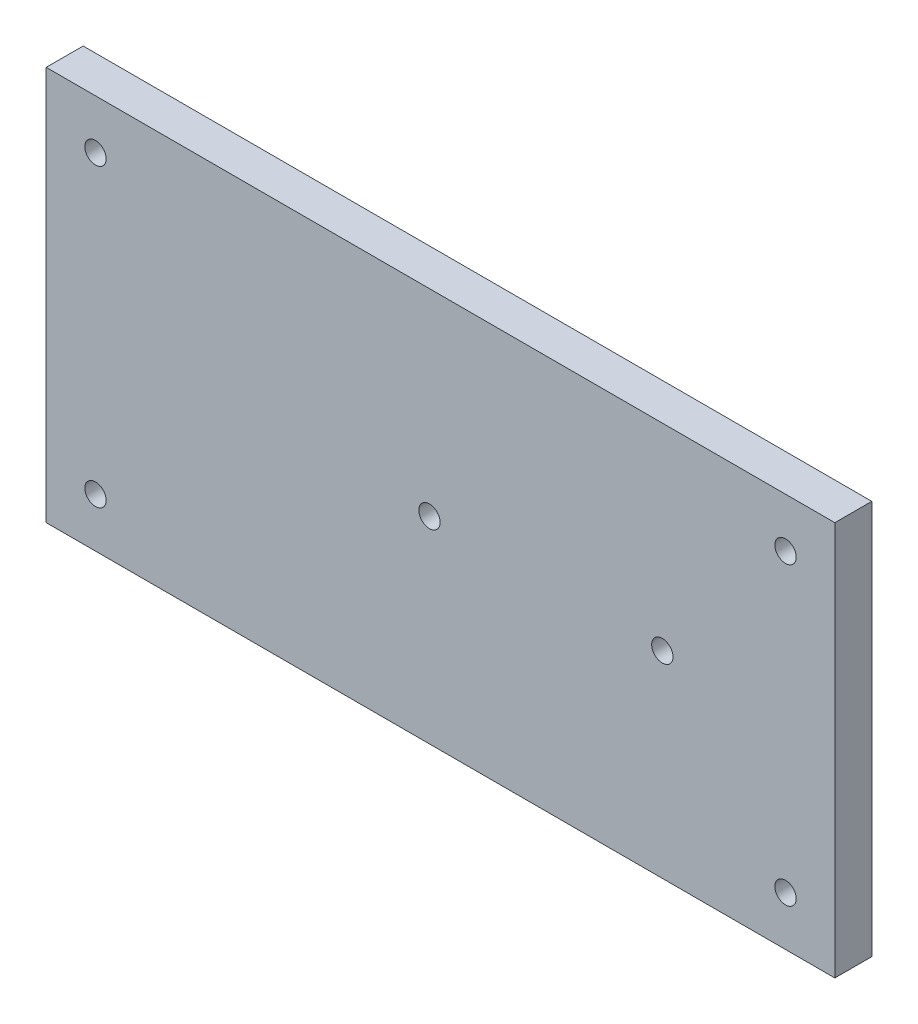
ISO-10303-21;
HEADER;
FILE_DESCRIPTION(('STEP AP214'),'2;1');
FILE_NAME('part.step','',(''),(''),'','','');
FILE_SCHEMA(('AUTOMOTIVE_DESIGN { 1 0 10303 214 1 1 1 1 }'));
ENDSEC;
DATA;
#1=APPLICATION_CONTEXT('core data for automotive mechanical design processes');
#2=APPLICATION_PROTOCOL_DEFINITION('international standard','automotive_design',2000,#1);
#3=PRODUCT_CONTEXT('',#1,'mechanical');
#4=PRODUCT('Part','Part','',(#3));
#5=PRODUCT_RELATED_PRODUCT_CATEGORY('part','',(#4));
#6=PRODUCT_DEFINITION_FORMATION('','',#4);
#7=PRODUCT_DEFINITION_CONTEXT('part definition',#1,'design');
#8=PRODUCT_DEFINITION('design','',#6,#7);
#9=PRODUCT_DEFINITION_SHAPE('','',#8);
#10=(LENGTH_UNIT() NAMED_UNIT(*) SI_UNIT(.MILLI.,.METRE.));
#11=(NAMED_UNIT(*) PLANE_ANGLE_UNIT() SI_UNIT($,.RADIAN.));
#12=(NAMED_UNIT(*) SI_UNIT($,.STERADIAN.) SOLID_ANGLE_UNIT());
#13=UNCERTAINTY_MEASURE_WITH_UNIT(LENGTH_MEASURE(1.E-05),#10,'distance_accuracy_value','');
#14=(GEOMETRIC_REPRESENTATION_CONTEXT(3) GLOBAL_UNCERTAINTY_ASSIGNED_CONTEXT((#13)) GLOBAL_UNIT_ASSIGNED_CONTEXT((#10,
#11,#12)) REPRESENTATION_CONTEXT('',''));
#15=CARTESIAN_POINT('',(0.,0.,0.));
#16=DIRECTION('',(0.,0.,1.));
#17=DIRECTION('',(1.,0.,0.));
#18=AXIS2_PLACEMENT_3D('',#15,#16,#17);
#19=CARTESIAN_POINT('',(0.,0.,9.525));
#20=DIRECTION('',(1.,0.,0.));
#21=DIRECTION('',(0.,0.,-1.));
#22=AXIS2_PLACEMENT_3D('',#19,#20,#21);
#23=PLANE('',#22);
#24=DIRECTION('',(0.,-1.,0.));
#25=VECTOR('',#24,1.);
#26=CARTESIAN_POINT('',(0.,0.,1.58749999999999));
#27=LINE('',#26,#25);
#28=CARTESIAN_POINT('',(0.,76.2,1.5875));
#29=VERTEX_POINT('',#28);
#30=CARTESIAN_POINT('',(0.,25.4,1.58749999999999));
#31=VERTEX_POINT('',#30);
#32=EDGE_CURVE('E11',#29,#31,#27,.T.);
#33=ORIENTED_EDGE('',*,*,#32,.T.);
#34=DIRECTION('',(0.,0.,-1.));
#35=VECTOR('',#34,1.);
#36=CARTESIAN_POINT('',(0.,25.4000000000001,9.52499999999956));
#37=LINE('',#36,#35);
#38=CARTESIAN_POINT('',(0.,25.4,0.));
#39=VERTEX_POINT('',#38);
#40=EDGE_CURVE('E139',#31,#39,#37,.T.);
#41=ORIENTED_EDGE('',*,*,#40,.T.);
#42=DIRECTION('',(0.,-1.,0.));
#43=VECTOR('',#42,1.);
#44=CARTESIAN_POINT('',(0.,0.,0.));
#45=LINE('',#44,#43);
#46=CARTESIAN_POINT('',(0.,0.,0.));
#47=VERTEX_POINT('',#46);
#48=EDGE_CURVE('E142',#39,#47,#45,.T.);
#49=ORIENTED_EDGE('',*,*,#48,.T.);
#50=DIRECTION('',(0.,0.,-1.));
#51=VECTOR('',#50,1.);
#52=CARTESIAN_POINT('',(0.,0.,9.525));
#53=LINE('',#52,#51);
#54=CARTESIAN_POINT('',(0.,0.,9.525));
#55=VERTEX_POINT('',#54);
#56=EDGE_CURVE('E164',#55,#47,#53,.T.);
#57=ORIENTED_EDGE('',*,*,#56,.F.);
#58=DIRECTION('',(0.,-1.,0.));
#59=VECTOR('',#58,1.);
#60=CARTESIAN_POINT('',(0.,0.,9.525));
#61=LINE('',#60,#59);
#62=CARTESIAN_POINT('',(0.,101.6,9.525));
#63=VERTEX_POINT('',#62);
#64=EDGE_CURVE('E143',#63,#55,#61,.T.);
#65=ORIENTED_EDGE('',*,*,#64,.F.);
#66=DIRECTION('',(0.,0.,-1.));
#67=VECTOR('',#66,1.);
#68=CARTESIAN_POINT('',(0.,101.6,9.525));
#69=LINE('',#68,#67);
#70=CARTESIAN_POINT('',(0.,101.6,0.));
#71=VERTEX_POINT('',#70);
#72=EDGE_CURVE('E149',#63,#71,#69,.T.);
#73=ORIENTED_EDGE('',*,*,#72,.T.);
#74=CARTESIAN_POINT('',(0.,76.2,0.));
#75=VERTEX_POINT('',#74);
#76=EDGE_CURVE('E150',#71,#75,#45,.T.);
#77=ORIENTED_EDGE('',*,*,#76,.T.);
#78=DIRECTION('',(0.,0.,1.));
#79=VECTOR('',#78,1.);
#80=CARTESIAN_POINT('',(0.,76.2000000000001,9.52499999999933));
#81=LINE('',#80,#79);
#82=EDGE_CURVE('E136',#75,#29,#81,.T.);
#83=ORIENTED_EDGE('',*,*,#82,.T.);
#84=EDGE_LOOP('',(#33,#41,#49,#57,#65,#73,#77,#83));
#85=FACE_BOUND('',#84,.T.);
#86=ADVANCED_FACE('F39',(#85),#23,.F.);
#87=CARTESIAN_POINT('',(0.,0.,9.525));
#88=DIRECTION('',(0.,1.,0.));
#89=DIRECTION('',(0.,0.,1.));
#90=AXIS2_PLACEMENT_3D('',#87,#88,#89);
#91=PLANE('',#90);
#92=DIRECTION('',(1.,0.,0.));
#93=VECTOR('',#92,1.);
#94=CARTESIAN_POINT('',(0.,0.,0.));
#95=LINE('',#94,#93);
#96=CARTESIAN_POINT('',(203.2,0.,0.));
#97=VERTEX_POINT('',#96);
#98=EDGE_CURVE('E153',#47,#97,#95,.T.);
#99=ORIENTED_EDGE('',*,*,#98,.T.);
#100=DIRECTION('',(0.,0.,-1.));
#101=VECTOR('',#100,1.);
#102=CARTESIAN_POINT('',(203.2,0.,9.525));
#103=LINE('',#102,#101);
#104=CARTESIAN_POINT('',(203.2,0.,9.525));
#105=VERTEX_POINT('',#104);
#106=EDGE_CURVE('E161',#105,#97,#103,.T.);
#107=ORIENTED_EDGE('',*,*,#106,.F.);
#108=DIRECTION('',(1.,0.,0.));
#109=VECTOR('',#108,1.);
#110=CARTESIAN_POINT('',(0.,0.,9.525));
#111=LINE('',#110,#109);
#112=EDGE_CURVE('E91',#55,#105,#111,.T.);
#113=ORIENTED_EDGE('',*,*,#112,.F.);
#114=ORIENTED_EDGE('',*,*,#56,.T.);
#115=EDGE_LOOP('',(#99,#107,#113,#114));
#116=FACE_BOUND('',#115,.T.);
#117=ADVANCED_FACE('F176',(#116),#91,.F.);
#118=CARTESIAN_POINT('',(203.2,0.,9.525));
#119=DIRECTION('',(-1.,0.,0.));
#120=DIRECTION('',(0.,0.,1.));
#121=AXIS2_PLACEMENT_3D('',#118,#119,#120);
#122=PLANE('',#121);
#123=DIRECTION('',(0.,1.,0.));
#124=VECTOR('',#123,1.);
#125=CARTESIAN_POINT('',(203.2,0.,0.));
#126=LINE('',#125,#124);
#127=CARTESIAN_POINT('',(203.2,101.6,0.));
#128=VERTEX_POINT('',#127);
#129=EDGE_CURVE('E155',#97,#128,#126,.T.);
#130=ORIENTED_EDGE('',*,*,#129,.T.);
#131=DIRECTION('',(0.,0.,-1.));
#132=VECTOR('',#131,1.);
#133=CARTESIAN_POINT('',(203.2,101.6,9.525));
#134=LINE('',#133,#132);
#135=CARTESIAN_POINT('',(203.2,101.6,9.525));
#136=VERTEX_POINT('',#135);
#137=EDGE_CURVE('E159',#136,#128,#134,.T.);
#138=ORIENTED_EDGE('',*,*,#137,.F.);
#139=DIRECTION('',(0.,1.,0.));
#140=VECTOR('',#139,1.);
#141=CARTESIAN_POINT('',(203.2,0.,9.525));
#142=LINE('',#141,#140);
#143=EDGE_CURVE('E146',#105,#136,#142,.T.);
#144=ORIENTED_EDGE('',*,*,#143,.F.);
#145=ORIENTED_EDGE('',*,*,#106,.T.);
#146=EDGE_LOOP('',(#130,#138,#144,#145));
#147=FACE_BOUND('',#146,.T.);
#148=ADVANCED_FACE('F183',(#147),#122,.F.);
#149=CARTESIAN_POINT('',(0.,101.6,9.525));
#150=DIRECTION('',(0.,-1.,0.));
#151=DIRECTION('',(0.,0.,-1.));
#152=AXIS2_PLACEMENT_3D('',#149,#150,#151);
#153=PLANE('',#152);
#154=DIRECTION('',(-1.,0.,0.));
#155=VECTOR('',#154,1.);
#156=CARTESIAN_POINT('',(0.,101.6,0.));
#157=LINE('',#156,#155);
#158=EDGE_CURVE('E83',#128,#71,#157,.T.);
#159=ORIENTED_EDGE('',*,*,#158,.T.);
#160=ORIENTED_EDGE('',*,*,#72,.F.);
#161=DIRECTION('',(-1.,0.,0.));
#162=VECTOR('',#161,1.);
#163=CARTESIAN_POINT('',(0.,101.6,9.525));
#164=LINE('',#163,#162);
#165=EDGE_CURVE('E62',#136,#63,#164,.T.);
#166=ORIENTED_EDGE('',*,*,#165,.F.);
#167=ORIENTED_EDGE('',*,*,#137,.T.);
#168=EDGE_LOOP('',(#159,#160,#166,#167));
#169=FACE_BOUND('',#168,.T.);
#170=ADVANCED_FACE('F184',(#169),#153,.F.);
#171=CARTESIAN_POINT('',(0.,0.,9.525));
#172=DIRECTION('',(0.,0.,-1.));
#173=DIRECTION('',(-1.,0.,0.));
#174=AXIS2_PLACEMENT_3D('',#171,#172,#173);
#175=PLANE('',#174);
#176=CARTESIAN_POINT('',(158.75,50.8,9.525));
#177=DIRECTION('',(0.,0.,1.));
#178=DIRECTION('',(1.,0.,0.));
#179=AXIS2_PLACEMENT_3D('',#176,#177,#178);
#180=CIRCLE('',#179,2.75);
#181=CARTESIAN_POINT('',(161.5,50.8,9.525));
#182=VERTEX_POINT('',#181);
#183=EDGE_CURVE('E459',#182,#182,#180,.T.);
#184=ORIENTED_EDGE('',*,*,#183,.F.);
#185=EDGE_LOOP('',(#184));
#186=FACE_BOUND('',#185,.T.);
#187=CARTESIAN_POINT('',(98.7552,50.8,9.525));
#188=DIRECTION('',(0.,0.,1.));
#189=DIRECTION('',(1.,0.,0.));
#190=AXIS2_PLACEMENT_3D('',#187,#188,#189);
#191=CIRCLE('',#190,2.75);
#192=CARTESIAN_POINT('',(101.5052,50.8,9.525));
#193=VERTEX_POINT('',#192);
#194=EDGE_CURVE('E461',#193,#193,#191,.T.);
#195=ORIENTED_EDGE('',*,*,#194,.F.);
#196=EDGE_LOOP('',(#195));
#197=FACE_BOUND('',#196,.T.);
#198=CARTESIAN_POINT('',(190.5,88.9,9.525));
#199=DIRECTION('',(0.,0.,-1.));
#200=DIRECTION('',(-1.,0.,0.));
#201=AXIS2_PLACEMENT_3D('',#198,#199,#200);
#202=CIRCLE('',#201,2.75);
#203=CARTESIAN_POINT('',(187.75,88.9,9.525));
#204=VERTEX_POINT('',#203);
#205=EDGE_CURVE('E478',#204,#204,#202,.T.);
#206=ORIENTED_EDGE('',*,*,#205,.T.);
#207=EDGE_LOOP('',(#206));
#208=FACE_BOUND('',#207,.T.);
#209=CARTESIAN_POINT('',(12.7,88.9,9.525));
#210=DIRECTION('',(0.,0.,-1.));
#211=DIRECTION('',(-1.,0.,0.));
#212=AXIS2_PLACEMENT_3D('',#209,#210,#211);
#213=CIRCLE('',#212,2.75);
#214=CARTESIAN_POINT('',(9.94999999999999,88.9,9.525));
#215=VERTEX_POINT('',#214);
#216=EDGE_CURVE('E490',#215,#215,#213,.T.);
#217=ORIENTED_EDGE('',*,*,#216,.T.);
#218=EDGE_LOOP('',(#217));
#219=FACE_BOUND('',#218,.T.);
#220=CARTESIAN_POINT('',(12.7,12.7,9.525));
#221=DIRECTION('',(0.,0.,-1.));
#222=DIRECTION('',(-1.,0.,0.));
#223=AXIS2_PLACEMENT_3D('',#220,#221,#222);
#224=CIRCLE('',#223,2.75);
#225=CARTESIAN_POINT('',(9.95,12.7,9.525));
#226=VERTEX_POINT('',#225);
#227=EDGE_CURVE('E502',#226,#226,#224,.T.);
#228=ORIENTED_EDGE('',*,*,#227,.T.);
#229=EDGE_LOOP('',(#228));
#230=FACE_BOUND('',#229,.T.);
#231=CARTESIAN_POINT('',(190.5,12.7,9.525));
#232=DIRECTION('',(0.,0.,-1.));
#233=DIRECTION('',(-1.,0.,0.));
#234=AXIS2_PLACEMENT_3D('',#231,#232,#233);
#235=CIRCLE('',#234,2.75);
#236=CARTESIAN_POINT('',(187.75,12.7,9.525));
#237=VERTEX_POINT('',#236);
#238=EDGE_CURVE('E514',#237,#237,#235,.T.);
#239=ORIENTED_EDGE('',*,*,#238,.T.);
#240=EDGE_LOOP('',(#239));
#241=FACE_BOUND('',#240,.T.);
#242=ORIENTED_EDGE('',*,*,#64,.T.);
#243=ORIENTED_EDGE('',*,*,#112,.T.);
#244=ORIENTED_EDGE('',*,*,#143,.T.);
#245=ORIENTED_EDGE('',*,*,#165,.T.);
#246=EDGE_LOOP('',(#242,#243,#244,#245));
#247=FACE_BOUND('',#246,.T.);
#248=ADVANCED_FACE('F179',(#186,#197,#208,#219,#230,#241,#247),#175,.F.);
#249=CARTESIAN_POINT('',(0.,0.,0.));
#250=DIRECTION('',(0.,0.,-1.));
#251=DIRECTION('',(-1.,0.,0.));
#252=AXIS2_PLACEMENT_3D('',#249,#250,#251);
#253=PLANE('',#252);
#254=CARTESIAN_POINT('',(158.75,50.8,0.));
#255=DIRECTION('',(0.,0.,1.));
#256=DIRECTION('',(1.,0.,0.));
#257=AXIS2_PLACEMENT_3D('',#254,#255,#256);
#258=CIRCLE('',#257,2.75);
#259=CARTESIAN_POINT('',(161.5,50.8,0.));
#260=VERTEX_POINT('',#259);
#261=EDGE_CURVE('E456',#260,#260,#258,.T.);
#262=ORIENTED_EDGE('',*,*,#261,.T.);
#263=EDGE_LOOP('',(#262));
#264=FACE_BOUND('',#263,.T.);
#265=CARTESIAN_POINT('',(98.7552,50.8,0.));
#266=DIRECTION('',(0.,0.,1.));
#267=DIRECTION('',(1.,0.,0.));
#268=AXIS2_PLACEMENT_3D('',#265,#266,#267);
#269=CIRCLE('',#268,2.75);
#270=CARTESIAN_POINT('',(101.5052,50.8,0.));
#271=VERTEX_POINT('',#270);
#272=EDGE_CURVE('E466',#271,#271,#269,.T.);
#273=ORIENTED_EDGE('',*,*,#272,.T.);
#274=EDGE_LOOP('',(#273));
#275=FACE_BOUND('',#274,.T.);
#276=CARTESIAN_POINT('',(190.5,88.9,0.));
#277=DIRECTION('',(0.,0.,-1.));
#278=DIRECTION('',(-1.,0.,0.));
#279=AXIS2_PLACEMENT_3D('',#276,#277,#278);
#280=CIRCLE('',#279,5.25);
#281=CARTESIAN_POINT('',(185.25,88.9,0.));
#282=VERTEX_POINT('',#281);
#283=EDGE_CURVE('E469',#282,#282,#280,.T.);
#284=ORIENTED_EDGE('',*,*,#283,.F.);
#285=EDGE_LOOP('',(#284));
#286=FACE_BOUND('',#285,.T.);
#287=CARTESIAN_POINT('',(12.7,88.9,0.));
#288=DIRECTION('',(0.,0.,-1.));
#289=DIRECTION('',(-1.,0.,0.));
#290=AXIS2_PLACEMENT_3D('',#287,#288,#289);
#291=CIRCLE('',#290,5.25);
#292=CARTESIAN_POINT('',(7.44999999999999,88.9,0.));
#293=VERTEX_POINT('',#292);
#294=EDGE_CURVE('E481',#293,#293,#291,.T.);
#295=ORIENTED_EDGE('',*,*,#294,.F.);
#296=EDGE_LOOP('',(#295));
#297=FACE_BOUND('',#296,.T.);
#298=CARTESIAN_POINT('',(12.7,12.7,0.));
#299=DIRECTION('',(0.,0.,-1.));
#300=DIRECTION('',(-1.,0.,0.));
#301=AXIS2_PLACEMENT_3D('',#298,#299,#300);
#302=CIRCLE('',#301,5.25);
#303=CARTESIAN_POINT('',(7.45,12.7,0.));
#304=VERTEX_POINT('',#303);
#305=EDGE_CURVE('E493',#304,#304,#302,.T.);
#306=ORIENTED_EDGE('',*,*,#305,.F.);
#307=EDGE_LOOP('',(#306));
#308=FACE_BOUND('',#307,.T.);
#309=CARTESIAN_POINT('',(190.5,12.7,0.));
#310=DIRECTION('',(0.,0.,-1.));
#311=DIRECTION('',(-1.,0.,0.));
#312=AXIS2_PLACEMENT_3D('',#309,#310,#311);
#313=CIRCLE('',#312,5.25);
#314=CARTESIAN_POINT('',(185.25,12.7,0.));
#315=VERTEX_POINT('',#314);
#316=EDGE_CURVE('E505',#315,#315,#313,.T.);
#317=ORIENTED_EDGE('',*,*,#316,.F.);
#318=EDGE_LOOP('',(#317));
#319=FACE_BOUND('',#318,.T.);
#320=DIRECTION('',(-1.,0.,0.));
#321=VECTOR('',#320,1.);
#322=CARTESIAN_POINT('',(0.,25.4,0.));
#323=LINE('',#322,#321);
#324=CARTESIAN_POINT('',(93.98,25.4,0.));
#325=VERTEX_POINT('',#324);
#326=EDGE_CURVE('E46',#325,#39,#323,.T.);
#327=ORIENTED_EDGE('',*,*,#326,.F.);
#328=DIRECTION('',(0.,1.,0.));
#329=VECTOR('',#328,1.);
#330=CARTESIAN_POINT('',(93.98,76.2,0.));
#331=LINE('',#330,#329);
#332=CARTESIAN_POINT('',(93.98,76.2,0.));
#333=VERTEX_POINT('',#332);
#334=EDGE_CURVE('E129',#325,#333,#331,.T.);
#335=ORIENTED_EDGE('',*,*,#334,.T.);
#336=DIRECTION('',(1.,0.,0.));
#337=VECTOR('',#336,1.);
#338=CARTESIAN_POINT('',(0.,76.2,0.));
#339=LINE('',#338,#337);
#340=EDGE_CURVE('E127',#75,#333,#339,.T.);
#341=ORIENTED_EDGE('',*,*,#340,.F.);
#342=ORIENTED_EDGE('',*,*,#76,.F.);
#343=ORIENTED_EDGE('',*,*,#158,.F.);
#344=ORIENTED_EDGE('',*,*,#129,.F.);
#345=ORIENTED_EDGE('',*,*,#98,.F.);
#346=ORIENTED_EDGE('',*,*,#48,.F.);
#347=EDGE_LOOP('',(#327,#335,#341,#342,#343,#344,#345,#346));
#348=FACE_BOUND('',#347,.T.);
#349=ADVANCED_FACE('F174',(#264,#275,#286,#297,#308,#319,#348),#253,.T.);
#350=CARTESIAN_POINT('',(-1.2E-05,76.2,1.5875));
#351=DIRECTION('',(0.,0.,1.));
#352=DIRECTION('',(0.,-1.,0.));
#353=AXIS2_PLACEMENT_3D('',#350,#351,#352);
#354=PLANE('',#353);
#355=DIRECTION('',(1.,0.,0.));
#356=VECTOR('',#355,1.);
#357=CARTESIAN_POINT('',(-1.2E-05,76.2,1.5875));
#358=LINE('',#357,#356);
#359=CARTESIAN_POINT('',(93.98,76.2,1.5875));
#360=VERTEX_POINT('',#359);
#361=EDGE_CURVE('E115',#29,#360,#358,.T.);
#362=ORIENTED_EDGE('',*,*,#361,.T.);
#363=DIRECTION('',(0.,-1.,0.));
#364=VECTOR('',#363,1.);
#365=CARTESIAN_POINT('',(93.98,76.2,1.5875));
#366=LINE('',#365,#364);
#367=CARTESIAN_POINT('',(93.98,25.4,1.58749999999999));
#368=VERTEX_POINT('',#367);
#369=EDGE_CURVE('E118',#360,#368,#366,.T.);
#370=ORIENTED_EDGE('',*,*,#369,.T.);
#371=DIRECTION('',(1.,0.,0.));
#372=VECTOR('',#371,1.);
#373=CARTESIAN_POINT('',(-1.2E-05,25.4,1.58749999999999));
#374=LINE('',#373,#372);
#375=EDGE_CURVE('E122',#31,#368,#374,.T.);
#376=ORIENTED_EDGE('',*,*,#375,.F.);
#377=ORIENTED_EDGE('',*,*,#32,.F.);
#378=EDGE_LOOP('',(#362,#370,#376,#377));
#379=FACE_BOUND('',#378,.T.);
#380=ADVANCED_FACE('F116',(#379),#354,.F.);
#381=CARTESIAN_POINT('',(-1.2E-05,25.4,0.));
#382=DIRECTION('',(0.,-1.,0.));
#383=DIRECTION('',(0.,0.,-1.));
#384=AXIS2_PLACEMENT_3D('',#381,#382,#383);
#385=PLANE('',#384);
#386=ORIENTED_EDGE('',*,*,#375,.T.);
#387=DIRECTION('',(0.,0.,-1.));
#388=VECTOR('',#387,1.);
#389=CARTESIAN_POINT('',(93.98,25.4,0.));
#390=LINE('',#389,#388);
#391=EDGE_CURVE('E123',#368,#325,#390,.T.);
#392=ORIENTED_EDGE('',*,*,#391,.T.);
#393=ORIENTED_EDGE('',*,*,#326,.T.);
#394=ORIENTED_EDGE('',*,*,#40,.F.);
#395=EDGE_LOOP('',(#386,#392,#393,#394));
#396=FACE_BOUND('',#395,.T.);
#397=ADVANCED_FACE('F168',(#396),#385,.F.);
#398=CARTESIAN_POINT('',(-1.2E-05,76.2,0.));
#399=DIRECTION('',(0.,1.,0.));
#400=DIRECTION('',(0.,0.,1.));
#401=AXIS2_PLACEMENT_3D('',#398,#399,#400);
#402=PLANE('',#401);
#403=ORIENTED_EDGE('',*,*,#340,.T.);
#404=DIRECTION('',(0.,0.,1.));
#405=VECTOR('',#404,1.);
#406=CARTESIAN_POINT('',(93.98,76.2,0.));
#407=LINE('',#406,#405);
#408=EDGE_CURVE('E53',#333,#360,#407,.T.);
#409=ORIENTED_EDGE('',*,*,#408,.T.);
#410=ORIENTED_EDGE('',*,*,#361,.F.);
#411=ORIENTED_EDGE('',*,*,#82,.F.);
#412=EDGE_LOOP('',(#403,#409,#410,#411));
#413=FACE_BOUND('',#412,.T.);
#414=ADVANCED_FACE('F125',(#413),#402,.F.);
#415=CARTESIAN_POINT('',(93.98,0.,0.));
#416=DIRECTION('',(-1.,0.,0.));
#417=DIRECTION('',(0.,0.,1.));
#418=AXIS2_PLACEMENT_3D('',#415,#416,#417);
#419=PLANE('',#418);
#420=ORIENTED_EDGE('',*,*,#334,.F.);
#421=ORIENTED_EDGE('',*,*,#391,.F.);
#422=ORIENTED_EDGE('',*,*,#369,.F.);
#423=ORIENTED_EDGE('',*,*,#408,.F.);
#424=EDGE_LOOP('',(#420,#421,#422,#423));
#425=FACE_BOUND('',#424,.T.);
#426=ADVANCED_FACE('F131',(#425),#419,.T.);
#427=CARTESIAN_POINT('',(190.5,12.7,0.));
#428=DIRECTION('',(0.,0.,-1.));
#429=DIRECTION('',(-1.,0.,0.));
#430=AXIS2_PLACEMENT_3D('',#427,#428,#429);
#431=CYLINDRICAL_SURFACE('',#430,2.75);
#432=ORIENTED_EDGE('',*,*,#238,.F.);
#433=EDGE_LOOP('',(#432));
#434=FACE_BOUND('',#433,.T.);
#435=CARTESIAN_POINT('',(190.5,12.7,2.75));
#436=DIRECTION('',(0.,0.,-1.));
#437=DIRECTION('',(-1.,0.,0.));
#438=AXIS2_PLACEMENT_3D('',#435,#436,#437);
#439=CIRCLE('',#438,2.75);
#440=CARTESIAN_POINT('',(187.75,12.7,2.75));
#441=VERTEX_POINT('',#440);
#442=EDGE_CURVE('E511',#441,#441,#439,.T.);
#443=ORIENTED_EDGE('',*,*,#442,.T.);
#444=EDGE_LOOP('',(#443));
#445=FACE_BOUND('',#444,.T.);
#446=ADVANCED_FACE('F255',(#434,#445),#431,.F.);
#447=CARTESIAN_POINT('',(193.25,12.7,2.75));
#448=DIRECTION('',(0.,0.,1.));
#449=DIRECTION('',(1.,0.,0.));
#450=AXIS2_PLACEMENT_3D('',#447,#448,#449);
#451=PLANE('',#450);
#452=ORIENTED_EDGE('',*,*,#442,.F.);
#453=EDGE_LOOP('',(#452));
#454=FACE_BOUND('',#453,.T.);
#455=CARTESIAN_POINT('',(190.5,12.7,2.75));
#456=DIRECTION('',(0.,0.,-1.));
#457=DIRECTION('',(-1.,0.,0.));
#458=AXIS2_PLACEMENT_3D('',#455,#456,#457);
#459=CIRCLE('',#458,5.25);
#460=CARTESIAN_POINT('',(185.25,12.7,2.75));
#461=VERTEX_POINT('',#460);
#462=EDGE_CURVE('E508',#461,#461,#459,.T.);
#463=ORIENTED_EDGE('',*,*,#462,.T.);
#464=EDGE_LOOP('',(#463));
#465=FACE_BOUND('',#464,.T.);
#466=ADVANCED_FACE('F265',(#454,#465),#451,.F.);
#467=CARTESIAN_POINT('',(190.5,12.7,0.));
#468=DIRECTION('',(0.,0.,-1.));
#469=DIRECTION('',(-1.,0.,0.));
#470=AXIS2_PLACEMENT_3D('',#467,#468,#469);
#471=CYLINDRICAL_SURFACE('',#470,5.25);
#472=ORIENTED_EDGE('',*,*,#462,.F.);
#473=EDGE_LOOP('',(#472));
#474=FACE_BOUND('',#473,.T.);
#475=ORIENTED_EDGE('',*,*,#316,.T.);
#476=EDGE_LOOP('',(#475));
#477=FACE_BOUND('',#476,.T.);
#478=ADVANCED_FACE('F276',(#474,#477),#471,.F.);
#479=CARTESIAN_POINT('',(12.7,12.7,0.));
#480=DIRECTION('',(0.,0.,-1.));
#481=DIRECTION('',(-1.,0.,0.));
#482=AXIS2_PLACEMENT_3D('',#479,#480,#481);
#483=CYLINDRICAL_SURFACE('',#482,2.75);
#484=ORIENTED_EDGE('',*,*,#227,.F.);
#485=EDGE_LOOP('',(#484));
#486=FACE_BOUND('',#485,.T.);
#487=CARTESIAN_POINT('',(12.7,12.7,2.75));
#488=DIRECTION('',(0.,0.,-1.));
#489=DIRECTION('',(-1.,0.,0.));
#490=AXIS2_PLACEMENT_3D('',#487,#488,#489);
#491=CIRCLE('',#490,2.75);
#492=CARTESIAN_POINT('',(9.95,12.7,2.75));
#493=VERTEX_POINT('',#492);
#494=EDGE_CURVE('E499',#493,#493,#491,.T.);
#495=ORIENTED_EDGE('',*,*,#494,.T.);
#496=EDGE_LOOP('',(#495));
#497=FACE_BOUND('',#496,.T.);
#498=ADVANCED_FACE('F287',(#486,#497),#483,.F.);
#499=CARTESIAN_POINT('',(15.45,12.7,2.75));
#500=DIRECTION('',(0.,0.,1.));
#501=DIRECTION('',(1.,0.,0.));
#502=AXIS2_PLACEMENT_3D('',#499,#500,#501);
#503=PLANE('',#502);
#504=ORIENTED_EDGE('',*,*,#494,.F.);
#505=EDGE_LOOP('',(#504));
#506=FACE_BOUND('',#505,.T.);
#507=CARTESIAN_POINT('',(12.7,12.7,2.75));
#508=DIRECTION('',(0.,0.,-1.));
#509=DIRECTION('',(-1.,0.,0.));
#510=AXIS2_PLACEMENT_3D('',#507,#508,#509);
#511=CIRCLE('',#510,5.25);
#512=CARTESIAN_POINT('',(7.45,12.7,2.75));
#513=VERTEX_POINT('',#512);
#514=EDGE_CURVE('E496',#513,#513,#511,.T.);
#515=ORIENTED_EDGE('',*,*,#514,.T.);
#516=EDGE_LOOP('',(#515));
#517=FACE_BOUND('',#516,.T.);
#518=ADVANCED_FACE('F298',(#506,#517),#503,.F.);
#519=CARTESIAN_POINT('',(12.7,12.7,0.));
#520=DIRECTION('',(0.,0.,-1.));
#521=DIRECTION('',(-1.,0.,0.));
#522=AXIS2_PLACEMENT_3D('',#519,#520,#521);
#523=CYLINDRICAL_SURFACE('',#522,5.25);
#524=ORIENTED_EDGE('',*,*,#514,.F.);
#525=EDGE_LOOP('',(#524));
#526=FACE_BOUND('',#525,.T.);
#527=ORIENTED_EDGE('',*,*,#305,.T.);
#528=EDGE_LOOP('',(#527));
#529=FACE_BOUND('',#528,.T.);
#530=ADVANCED_FACE('F309',(#526,#529),#523,.F.);
#531=CARTESIAN_POINT('',(12.7,88.9,0.));
#532=DIRECTION('',(0.,0.,-1.));
#533=DIRECTION('',(-1.,0.,0.));
#534=AXIS2_PLACEMENT_3D('',#531,#532,#533);
#535=CYLINDRICAL_SURFACE('',#534,2.75);
#536=ORIENTED_EDGE('',*,*,#216,.F.);
#537=EDGE_LOOP('',(#536));
#538=FACE_BOUND('',#537,.T.);
#539=CARTESIAN_POINT('',(12.7,88.9,2.75));
#540=DIRECTION('',(0.,0.,-1.));
#541=DIRECTION('',(-1.,0.,0.));
#542=AXIS2_PLACEMENT_3D('',#539,#540,#541);
#543=CIRCLE('',#542,2.75);
#544=CARTESIAN_POINT('',(9.94999999999999,88.9,2.75));
#545=VERTEX_POINT('',#544);
#546=EDGE_CURVE('E487',#545,#545,#543,.T.);
#547=ORIENTED_EDGE('',*,*,#546,.T.);
#548=EDGE_LOOP('',(#547));
#549=FACE_BOUND('',#548,.T.);
#550=ADVANCED_FACE('F320',(#538,#549),#535,.F.);
#551=CARTESIAN_POINT('',(15.45,88.9,2.75));
#552=DIRECTION('',(0.,0.,1.));
#553=DIRECTION('',(1.,0.,0.));
#554=AXIS2_PLACEMENT_3D('',#551,#552,#553);
#555=PLANE('',#554);
#556=ORIENTED_EDGE('',*,*,#546,.F.);
#557=EDGE_LOOP('',(#556));
#558=FACE_BOUND('',#557,.T.);
#559=CARTESIAN_POINT('',(12.7,88.9,2.75));
#560=DIRECTION('',(0.,0.,-1.));
#561=DIRECTION('',(-1.,0.,0.));
#562=AXIS2_PLACEMENT_3D('',#559,#560,#561);
#563=CIRCLE('',#562,5.25);
#564=CARTESIAN_POINT('',(7.44999999999999,88.9,2.75));
#565=VERTEX_POINT('',#564);
#566=EDGE_CURVE('E484',#565,#565,#563,.T.);
#567=ORIENTED_EDGE('',*,*,#566,.T.);
#568=EDGE_LOOP('',(#567));
#569=FACE_BOUND('',#568,.T.);
#570=ADVANCED_FACE('F331',(#558,#569),#555,.F.);
#571=CARTESIAN_POINT('',(12.7,88.9,0.));
#572=DIRECTION('',(0.,0.,-1.));
#573=DIRECTION('',(-1.,0.,0.));
#574=AXIS2_PLACEMENT_3D('',#571,#572,#573);
#575=CYLINDRICAL_SURFACE('',#574,5.25);
#576=ORIENTED_EDGE('',*,*,#566,.F.);
#577=EDGE_LOOP('',(#576));
#578=FACE_BOUND('',#577,.T.);
#579=ORIENTED_EDGE('',*,*,#294,.T.);
#580=EDGE_LOOP('',(#579));
#581=FACE_BOUND('',#580,.T.);
#582=ADVANCED_FACE('F342',(#578,#581),#575,.F.);
#583=CARTESIAN_POINT('',(190.5,88.9,0.));
#584=DIRECTION('',(0.,0.,-1.));
#585=DIRECTION('',(-1.,0.,0.));
#586=AXIS2_PLACEMENT_3D('',#583,#584,#585);
#587=CYLINDRICAL_SURFACE('',#586,2.75);
#588=ORIENTED_EDGE('',*,*,#205,.F.);
#589=EDGE_LOOP('',(#588));
#590=FACE_BOUND('',#589,.T.);
#591=CARTESIAN_POINT('',(190.5,88.9,2.75));
#592=DIRECTION('',(0.,0.,-1.));
#593=DIRECTION('',(-1.,0.,0.));
#594=AXIS2_PLACEMENT_3D('',#591,#592,#593);
#595=CIRCLE('',#594,2.75);
#596=CARTESIAN_POINT('',(187.75,88.9,2.75));
#597=VERTEX_POINT('',#596);
#598=EDGE_CURVE('E475',#597,#597,#595,.T.);
#599=ORIENTED_EDGE('',*,*,#598,.T.);
#600=EDGE_LOOP('',(#599));
#601=FACE_BOUND('',#600,.T.);
#602=ADVANCED_FACE('F353',(#590,#601),#587,.F.);
#603=CARTESIAN_POINT('',(193.25,88.9,2.75));
#604=DIRECTION('',(0.,0.,1.));
#605=DIRECTION('',(1.,0.,0.));
#606=AXIS2_PLACEMENT_3D('',#603,#604,#605);
#607=PLANE('',#606);
#608=ORIENTED_EDGE('',*,*,#598,.F.);
#609=EDGE_LOOP('',(#608));
#610=FACE_BOUND('',#609,.T.);
#611=CARTESIAN_POINT('',(190.5,88.9,2.75));
#612=DIRECTION('',(0.,0.,-1.));
#613=DIRECTION('',(-1.,0.,0.));
#614=AXIS2_PLACEMENT_3D('',#611,#612,#613);
#615=CIRCLE('',#614,5.25);
#616=CARTESIAN_POINT('',(185.25,88.9,2.75));
#617=VERTEX_POINT('',#616);
#618=EDGE_CURVE('E472',#617,#617,#615,.T.);
#619=ORIENTED_EDGE('',*,*,#618,.T.);
#620=EDGE_LOOP('',(#619));
#621=FACE_BOUND('',#620,.T.);
#622=ADVANCED_FACE('F364',(#610,#621),#607,.F.);
#623=CARTESIAN_POINT('',(190.5,88.9,0.));
#624=DIRECTION('',(0.,0.,-1.));
#625=DIRECTION('',(-1.,0.,0.));
#626=AXIS2_PLACEMENT_3D('',#623,#624,#625);
#627=CYLINDRICAL_SURFACE('',#626,5.25);
#628=ORIENTED_EDGE('',*,*,#618,.F.);
#629=EDGE_LOOP('',(#628));
#630=FACE_BOUND('',#629,.T.);
#631=ORIENTED_EDGE('',*,*,#283,.T.);
#632=EDGE_LOOP('',(#631));
#633=FACE_BOUND('',#632,.T.);
#634=ADVANCED_FACE('F375',(#630,#633),#627,.F.);
#635=CARTESIAN_POINT('',(98.7552,50.8,9.525));
#636=DIRECTION('',(0.,0.,1.));
#637=DIRECTION('',(1.,0.,0.));
#638=AXIS2_PLACEMENT_3D('',#635,#636,#637);
#639=CYLINDRICAL_SURFACE('',#638,2.75);
#640=ORIENTED_EDGE('',*,*,#272,.F.);
#641=EDGE_LOOP('',(#640));
#642=FACE_BOUND('',#641,.T.);
#643=ORIENTED_EDGE('',*,*,#194,.T.);
#644=EDGE_LOOP('',(#643));
#645=FACE_BOUND('',#644,.T.);
#646=ADVANCED_FACE('F386',(#642,#645),#639,.F.);
#647=CARTESIAN_POINT('',(158.75,50.8,9.525));
#648=DIRECTION('',(0.,0.,1.));
#649=DIRECTION('',(1.,0.,0.));
#650=AXIS2_PLACEMENT_3D('',#647,#648,#649);
#651=CYLINDRICAL_SURFACE('',#650,2.75);
#652=ORIENTED_EDGE('',*,*,#261,.F.);
#653=EDGE_LOOP('',(#652));
#654=FACE_BOUND('',#653,.T.);
#655=ORIENTED_EDGE('',*,*,#183,.T.);
#656=EDGE_LOOP('',(#655));
#657=FACE_BOUND('',#656,.T.);
#658=ADVANCED_FACE('F410',(#654,#657),#651,.F.);
#659=CLOSED_SHELL('',(#86,#117,#148,#170,#248,#349,#380,#397,#414,#426,#446,#466,#478,#498,#518,
#530,#550,#570,#582,#602,#622,#634,#646,#658));
#660=MANIFOLD_SOLID_BREP('B2',#659);
#661=ADVANCED_BREP_SHAPE_REPRESENTATION('',(#18,#660),#14);
#662=SHAPE_DEFINITION_REPRESENTATION(#9,#661);
ENDSEC;
END-ISO-10303-21;
